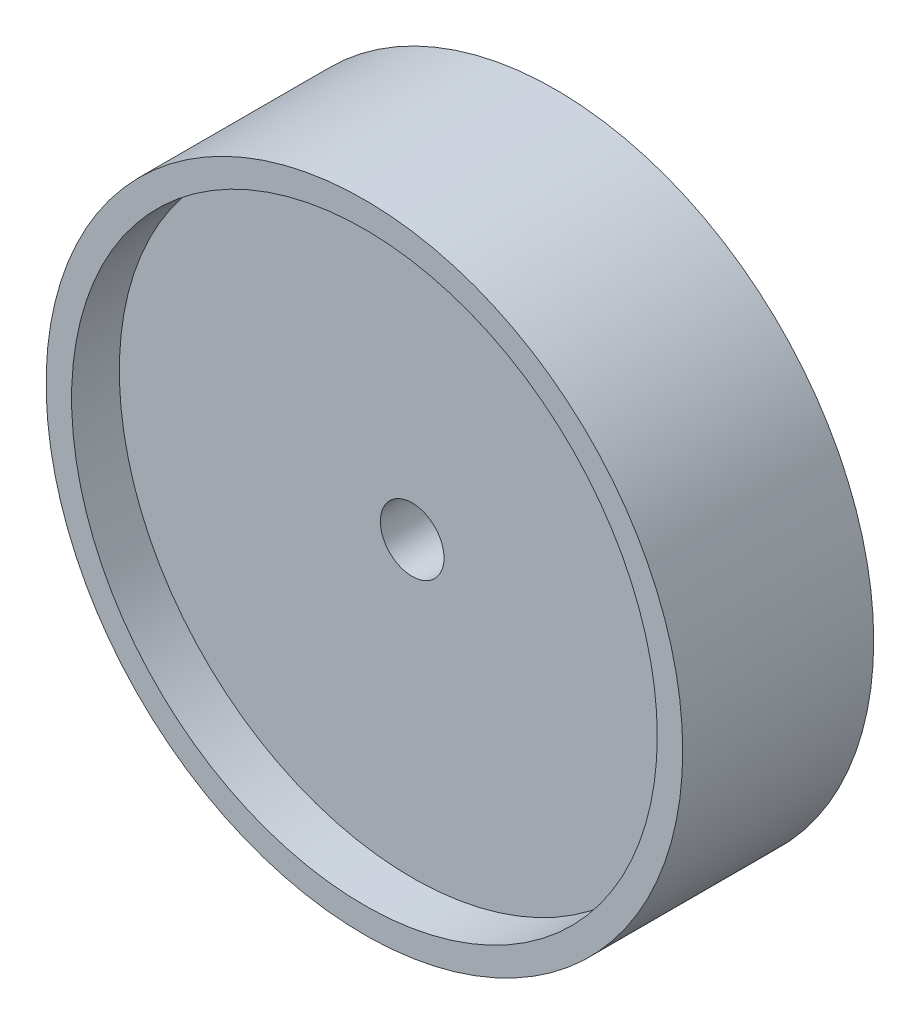
ISO-10303-21;
HEADER;
FILE_DESCRIPTION(('STEP AP214'),'2;1');
FILE_NAME('part.step','',(''),(''),'','','');
FILE_SCHEMA(('AUTOMOTIVE_DESIGN { 1 0 10303 214 1 1 1 1 }'));
ENDSEC;
DATA;
#1=APPLICATION_CONTEXT('core data for automotive mechanical design processes');
#2=APPLICATION_PROTOCOL_DEFINITION('international standard','automotive_design',2000,#1);
#3=PRODUCT_CONTEXT('',#1,'mechanical');
#4=PRODUCT('Part','Part','',(#3));
#5=PRODUCT_RELATED_PRODUCT_CATEGORY('part','',(#4));
#6=PRODUCT_DEFINITION_FORMATION('','',#4);
#7=PRODUCT_DEFINITION_CONTEXT('part definition',#1,'design');
#8=PRODUCT_DEFINITION('design','',#6,#7);
#9=PRODUCT_DEFINITION_SHAPE('','',#8);
#10=(LENGTH_UNIT() NAMED_UNIT(*) SI_UNIT(.MILLI.,.METRE.));
#11=(NAMED_UNIT(*) PLANE_ANGLE_UNIT() SI_UNIT($,.RADIAN.));
#12=(NAMED_UNIT(*) SI_UNIT($,.STERADIAN.) SOLID_ANGLE_UNIT());
#13=UNCERTAINTY_MEASURE_WITH_UNIT(LENGTH_MEASURE(1.E-05),#10,'distance_accuracy_value','');
#14=(GEOMETRIC_REPRESENTATION_CONTEXT(3) GLOBAL_UNCERTAINTY_ASSIGNED_CONTEXT((#13)) GLOBAL_UNIT_ASSIGNED_CONTEXT((#10,
#11,#12)) REPRESENTATION_CONTEXT('',''));
#15=CARTESIAN_POINT('',(0.,0.,0.));
#16=DIRECTION('',(0.,0.,1.));
#17=DIRECTION('',(1.,0.,0.));
#18=AXIS2_PLACEMENT_3D('',#15,#16,#17);
#19=CARTESIAN_POINT('',(0.,0.,-37.5));
#20=DIRECTION('',(0.,0.,1.));
#21=DIRECTION('',(1.,0.,0.));
#22=AXIS2_PLACEMENT_3D('',#19,#20,#21);
#23=CYLINDRICAL_SURFACE('',#22,250.);
#24=CARTESIAN_POINT('',(0.,0.,-37.5));
#25=DIRECTION('',(0.,0.,1.));
#26=DIRECTION('',(1.,0.,0.));
#27=AXIS2_PLACEMENT_3D('',#24,#25,#26);
#28=CIRCLE('',#27,250.);
#29=CARTESIAN_POINT('',(250.,0.,-37.5));
#30=VERTEX_POINT('',#29);
#31=EDGE_CURVE('E11',#30,#30,#28,.T.);
#32=ORIENTED_EDGE('',*,*,#31,.T.);
#33=EDGE_LOOP('',(#32));
#34=FACE_BOUND('',#33,.T.);
#35=CARTESIAN_POINT('',(0.,0.,112.5));
#36=DIRECTION('',(0.,0.,1.));
#37=DIRECTION('',(1.,0.,0.));
#38=AXIS2_PLACEMENT_3D('',#35,#36,#37);
#39=CIRCLE('',#38,250.);
#40=CARTESIAN_POINT('',(250.,0.,112.5));
#41=VERTEX_POINT('',#40);
#42=EDGE_CURVE('E53',#41,#41,#39,.T.);
#43=ORIENTED_EDGE('',*,*,#42,.F.);
#44=EDGE_LOOP('',(#43));
#45=FACE_BOUND('',#44,.T.);
#46=ADVANCED_FACE('F43',(#34,#45),#23,.T.);
#47=CARTESIAN_POINT('',(0.,0.,-37.5));
#48=DIRECTION('',(0.,0.,1.));
#49=DIRECTION('',(1.,0.,0.));
#50=AXIS2_PLACEMENT_3D('',#47,#48,#49);
#51=PLANE('',#50);
#52=CARTESIAN_POINT('',(0.,0.,-37.5));
#53=DIRECTION('',(0.,0.,1.));
#54=DIRECTION('',(1.,0.,0.));
#55=AXIS2_PLACEMENT_3D('',#52,#53,#54);
#56=CIRCLE('',#55,230.);
#57=CARTESIAN_POINT('',(230.,0.,-37.5));
#58=VERTEX_POINT('',#57);
#59=EDGE_CURVE('E49',#58,#58,#56,.T.);
#60=ORIENTED_EDGE('',*,*,#59,.T.);
#61=EDGE_LOOP('',(#60));
#62=FACE_BOUND('',#61,.T.);
#63=ORIENTED_EDGE('',*,*,#31,.F.);
#64=EDGE_LOOP('',(#63));
#65=FACE_BOUND('',#64,.T.);
#66=ADVANCED_FACE('F72',(#62,#65),#51,.F.);
#67=CARTESIAN_POINT('',(0.,0.,-37.5));
#68=DIRECTION('',(0.,0.,1.));
#69=DIRECTION('',(1.,0.,0.));
#70=AXIS2_PLACEMENT_3D('',#67,#68,#69);
#71=CYLINDRICAL_SURFACE('',#70,230.);
#72=ORIENTED_EDGE('',*,*,#59,.F.);
#73=EDGE_LOOP('',(#72));
#74=FACE_BOUND('',#73,.T.);
#75=CARTESIAN_POINT('',(0.,0.,112.5));
#76=DIRECTION('',(0.,0.,1.));
#77=DIRECTION('',(1.,0.,0.));
#78=AXIS2_PLACEMENT_3D('',#75,#76,#77);
#79=CIRCLE('',#78,230.);
#80=CARTESIAN_POINT('',(230.,0.,112.5));
#81=VERTEX_POINT('',#80);
#82=EDGE_CURVE('E57',#81,#81,#79,.T.);
#83=ORIENTED_EDGE('',*,*,#82,.T.);
#84=EDGE_LOOP('',(#83));
#85=FACE_BOUND('',#84,.T.);
#86=ADVANCED_FACE('F63',(#74,#85),#71,.F.);
#87=CARTESIAN_POINT('',(0.,0.,112.5));
#88=DIRECTION('',(0.,0.,1.));
#89=DIRECTION('',(1.,0.,0.));
#90=AXIS2_PLACEMENT_3D('',#87,#88,#89);
#91=PLANE('',#90);
#92=ORIENTED_EDGE('',*,*,#42,.T.);
#93=EDGE_LOOP('',(#92));
#94=FACE_BOUND('',#93,.T.);
#95=ORIENTED_EDGE('',*,*,#82,.F.);
#96=EDGE_LOOP('',(#95));
#97=FACE_BOUND('',#96,.T.);
#98=ADVANCED_FACE('F65',(#94,#97),#91,.T.);
#99=CLOSED_SHELL('',(#46,#66,#86,#98));
#100=MANIFOLD_SOLID_BREP('B2',#99);
#101=CARTESIAN_POINT('',(0.,0.,75.));
#102=DIRECTION('',(0.,0.,-1.));
#103=DIRECTION('',(-1.,0.,0.));
#104=AXIS2_PLACEMENT_3D('',#101,#102,#103);
#105=CYLINDRICAL_SURFACE('',#104,230.);
#106=CARTESIAN_POINT('',(0.,0.,75.));
#107=DIRECTION('',(0.,0.,1.));
#108=DIRECTION('',(1.,0.,0.));
#109=AXIS2_PLACEMENT_3D('',#106,#107,#108);
#110=CIRCLE('',#109,230.);
#111=CARTESIAN_POINT('',(230.,0.,75.));
#112=VERTEX_POINT('',#111);
#113=EDGE_CURVE('E42',#112,#112,#110,.T.);
#114=ORIENTED_EDGE('',*,*,#113,.F.);
#115=EDGE_LOOP('',(#114));
#116=FACE_BOUND('',#115,.T.);
#117=CARTESIAN_POINT('',(0.,0.,0.));
#118=DIRECTION('',(0.,0.,1.));
#119=DIRECTION('',(1.,0.,0.));
#120=AXIS2_PLACEMENT_3D('',#117,#118,#119);
#121=CIRCLE('',#120,230.);
#122=CARTESIAN_POINT('',(230.,0.,0.));
#123=VERTEX_POINT('',#122);
#124=EDGE_CURVE('E111',#123,#123,#121,.T.);
#125=ORIENTED_EDGE('',*,*,#124,.T.);
#126=EDGE_LOOP('',(#125));
#127=FACE_BOUND('',#126,.T.);
#128=ADVANCED_FACE('F104',(#116,#127),#105,.T.);
#129=CARTESIAN_POINT('',(0.,0.,75.));
#130=DIRECTION('',(0.,0.,1.));
#131=DIRECTION('',(1.,0.,0.));
#132=AXIS2_PLACEMENT_3D('',#129,#130,#131);
#133=PLANE('',#132);
#134=CARTESIAN_POINT('',(0.,0.,75.));
#135=DIRECTION('',(0.,0.,1.));
#136=DIRECTION('',(1.,0.,0.));
#137=AXIS2_PLACEMENT_3D('',#134,#135,#136);
#138=CIRCLE('',#137,25.);
#139=CARTESIAN_POINT('',(25.,0.,75.));
#140=VERTEX_POINT('',#139);
#141=EDGE_CURVE('E117',#140,#140,#138,.T.);
#142=ORIENTED_EDGE('',*,*,#141,.F.);
#143=EDGE_LOOP('',(#142));
#144=FACE_BOUND('',#143,.T.);
#145=ORIENTED_EDGE('',*,*,#113,.T.);
#146=EDGE_LOOP('',(#145));
#147=FACE_BOUND('',#146,.T.);
#148=ADVANCED_FACE('F133',(#144,#147),#133,.T.);
#149=CARTESIAN_POINT('',(0.,0.,0.));
#150=DIRECTION('',(0.,0.,1.));
#151=DIRECTION('',(1.,0.,0.));
#152=AXIS2_PLACEMENT_3D('',#149,#150,#151);
#153=PLANE('',#152);
#154=CARTESIAN_POINT('',(0.,0.,0.));
#155=DIRECTION('',(0.,0.,1.));
#156=DIRECTION('',(1.,0.,0.));
#157=AXIS2_PLACEMENT_3D('',#154,#155,#156);
#158=CIRCLE('',#157,25.);
#159=CARTESIAN_POINT('',(25.,0.,0.));
#160=VERTEX_POINT('',#159);
#161=EDGE_CURVE('E107',#160,#160,#158,.T.);
#162=ORIENTED_EDGE('',*,*,#161,.T.);
#163=EDGE_LOOP('',(#162));
#164=FACE_BOUND('',#163,.T.);
#165=ORIENTED_EDGE('',*,*,#124,.F.);
#166=EDGE_LOOP('',(#165));
#167=FACE_BOUND('',#166,.T.);
#168=ADVANCED_FACE('F124',(#164,#167),#153,.F.);
#169=CARTESIAN_POINT('',(0.,0.,-37.5));
#170=DIRECTION('',(0.,0.,1.));
#171=DIRECTION('',(1.,0.,0.));
#172=AXIS2_PLACEMENT_3D('',#169,#170,#171);
#173=CYLINDRICAL_SURFACE('',#172,25.);
#174=ORIENTED_EDGE('',*,*,#141,.T.);
#175=EDGE_LOOP('',(#174));
#176=FACE_BOUND('',#175,.T.);
#177=ORIENTED_EDGE('',*,*,#161,.F.);
#178=EDGE_LOOP('',(#177));
#179=FACE_BOUND('',#178,.T.);
#180=ADVANCED_FACE('F127',(#176,#179),#173,.F.);
#181=CLOSED_SHELL('',(#128,#148,#168,#180));
#182=MANIFOLD_SOLID_BREP('B6',#181);
#183=ADVANCED_BREP_SHAPE_REPRESENTATION('',(#18,#100,#182),#14);
#184=SHAPE_DEFINITION_REPRESENTATION(#9,#183);
ENDSEC;
END-ISO-10303-21;
